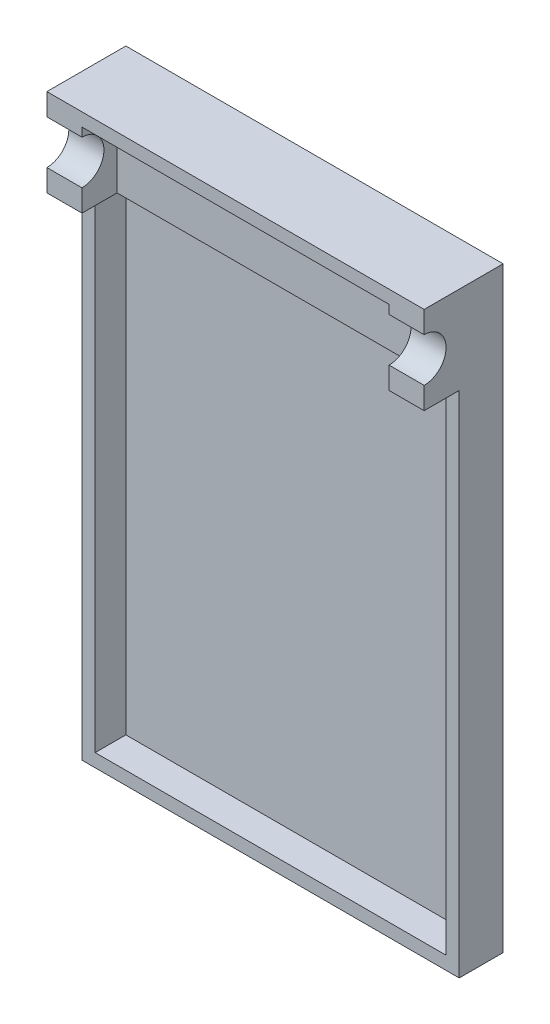
ISO-10303-21;
HEADER;
FILE_DESCRIPTION(('STEP AP214'),'2;1');
FILE_NAME('part.step','',(''),(''),'','','');
FILE_SCHEMA(('AUTOMOTIVE_DESIGN { 1 0 10303 214 1 1 1 1 }'));
ENDSEC;
DATA;
#1=APPLICATION_CONTEXT('core data for automotive mechanical design processes');
#2=APPLICATION_PROTOCOL_DEFINITION('international standard','automotive_design',2000,#1);
#3=PRODUCT_CONTEXT('',#1,'mechanical');
#4=PRODUCT('Part','Part','',(#3));
#5=PRODUCT_RELATED_PRODUCT_CATEGORY('part','',(#4));
#6=PRODUCT_DEFINITION_FORMATION('','',#4);
#7=PRODUCT_DEFINITION_CONTEXT('part definition',#1,'design');
#8=PRODUCT_DEFINITION('design','',#6,#7);
#9=PRODUCT_DEFINITION_SHAPE('','',#8);
#10=(LENGTH_UNIT() NAMED_UNIT(*) SI_UNIT(.MILLI.,.METRE.));
#11=(NAMED_UNIT(*) PLANE_ANGLE_UNIT() SI_UNIT($,.RADIAN.));
#12=(NAMED_UNIT(*) SI_UNIT($,.STERADIAN.) SOLID_ANGLE_UNIT());
#13=UNCERTAINTY_MEASURE_WITH_UNIT(LENGTH_MEASURE(1.E-05),#10,'distance_accuracy_value','');
#14=(GEOMETRIC_REPRESENTATION_CONTEXT(3) GLOBAL_UNCERTAINTY_ASSIGNED_CONTEXT((#13)) GLOBAL_UNIT_ASSIGNED_CONTEXT((#10,
#11,#12)) REPRESENTATION_CONTEXT('',''));
#15=CARTESIAN_POINT('',(0.,0.,0.));
#16=DIRECTION('',(0.,0.,1.));
#17=DIRECTION('',(1.,0.,0.));
#18=AXIS2_PLACEMENT_3D('',#15,#16,#17);
#19=CARTESIAN_POINT('',(-20.6487571144217,89.6274453394707,10.));
#20=DIRECTION('',(0.,-1.,0.));
#21=DIRECTION('',(0.,0.,-1.));
#22=AXIS2_PLACEMENT_3D('',#19,#20,#21);
#23=PLANE('',#22);
#24=DIRECTION('',(0.,0.,-1.));
#25=VECTOR('',#24,1.);
#26=CARTESIAN_POINT('',(-15.6487571144217,89.6274453394707,18.));
#27=LINE('',#26,#25);
#28=CARTESIAN_POINT('',(-15.6487571144217,89.6274453394707,18.));
#29=VERTEX_POINT('',#28);
#30=CARTESIAN_POINT('',(-15.6487571144217,89.6274453394707,10.));
#31=VERTEX_POINT('',#30);
#32=EDGE_CURVE('E203',#29,#31,#27,.T.);
#33=ORIENTED_EDGE('',*,*,#32,.T.);
#34=DIRECTION('',(1.,0.,0.));
#35=VECTOR('',#34,1.);
#36=CARTESIAN_POINT('',(-20.6487571144217,89.6274453394707,10.));
#37=LINE('',#36,#35);
#38=CARTESIAN_POINT('',(54.3512428855784,89.6274453394707,10.));
#39=VERTEX_POINT('',#38);
#40=EDGE_CURVE('E191',#31,#39,#37,.T.);
#41=ORIENTED_EDGE('',*,*,#40,.T.);
#42=DIRECTION('',(0.,0.,1.));
#43=VECTOR('',#42,1.);
#44=CARTESIAN_POINT('',(54.3512428855784,89.6274453394707,3.));
#45=LINE('',#44,#43);
#46=CARTESIAN_POINT('',(54.3512428855784,89.6274453394707,18.));
#47=VERTEX_POINT('',#46);
#48=EDGE_CURVE('E205',#39,#47,#45,.T.);
#49=ORIENTED_EDGE('',*,*,#48,.T.);
#50=DIRECTION('',(-1.,0.,0.));
#51=VECTOR('',#50,1.);
#52=CARTESIAN_POINT('',(-15.6487571144217,89.6274453394707,18.));
#53=LINE('',#52,#51);
#54=EDGE_CURVE('E208',#47,#29,#53,.T.);
#55=ORIENTED_EDGE('',*,*,#54,.T.);
#56=EDGE_LOOP('',(#33,#41,#49,#55));
#57=FACE_BOUND('',#56,.T.);
#58=ADVANCED_FACE('F35',(#57),#23,.T.);
#59=CARTESIAN_POINT('',(-20.6487571144217,89.6274453394707,10.));
#60=DIRECTION('',(1.,0.,0.));
#61=DIRECTION('',(0.,1.,0.));
#62=AXIS2_PLACEMENT_3D('',#59,#60,#61);
#63=PLANE('',#62);
#64=DIRECTION('',(0.,-1.,0.));
#65=VECTOR('',#64,1.);
#66=CARTESIAN_POINT('',(-20.6487571144217,0.,3.));
#67=LINE('',#66,#65);
#68=CARTESIAN_POINT('',(-20.6487571144217,79.6274453394707,3.));
#69=VERTEX_POINT('',#68);
#70=CARTESIAN_POINT('',(-20.6487571144217,-40.3725546605293,3.));
#71=VERTEX_POINT('',#70);
#72=EDGE_CURVE('E264',#69,#71,#67,.T.);
#73=ORIENTED_EDGE('',*,*,#72,.F.);
#74=DIRECTION('',(0.,0.707106781186547,-0.707106781186548));
#75=VECTOR('',#74,1.);
#76=CARTESIAN_POINT('',(-20.6487571144217,72.6274453394707,10.));
#77=LINE('',#76,#75);
#78=CARTESIAN_POINT('',(-20.6487571144217,72.6274453394707,10.));
#79=VERTEX_POINT('',#78);
#80=EDGE_CURVE('E196',#79,#69,#77,.T.);
#81=ORIENTED_EDGE('',*,*,#80,.F.);
#82=DIRECTION('',(0.,-1.,0.));
#83=VECTOR('',#82,1.);
#84=CARTESIAN_POINT('',(-20.6487571144217,89.6274453394707,10.));
#85=LINE('',#84,#83);
#86=CARTESIAN_POINT('',(-20.6487571144217,-40.3725546605293,10.));
#87=VERTEX_POINT('',#86);
#88=EDGE_CURVE('E266',#79,#87,#85,.T.);
#89=ORIENTED_EDGE('',*,*,#88,.T.);
#90=DIRECTION('',(0.,0.,-1.));
#91=VECTOR('',#90,1.);
#92=CARTESIAN_POINT('',(-20.6487571144217,-40.3725546605293,10.));
#93=LINE('',#92,#91);
#94=EDGE_CURVE('E276',#87,#71,#93,.T.);
#95=ORIENTED_EDGE('',*,*,#94,.T.);
#96=EDGE_LOOP('',(#73,#81,#89,#95));
#97=FACE_BOUND('',#96,.T.);
#98=ADVANCED_FACE('F356',(#97),#63,.T.);
#99=CARTESIAN_POINT('',(59.3512428855783,89.6274453394707,10.));
#100=DIRECTION('',(-1.,0.,0.));
#101=DIRECTION('',(0.,0.,1.));
#102=AXIS2_PLACEMENT_3D('',#99,#100,#101);
#103=PLANE('',#102);
#104=DIRECTION('',(0.,1.,0.));
#105=VECTOR('',#104,1.);
#106=CARTESIAN_POINT('',(59.3512428855783,89.6274453394707,10.));
#107=LINE('',#106,#105);
#108=CARTESIAN_POINT('',(59.3512428855783,-40.3725546605293,10.));
#109=VERTEX_POINT('',#108);
#110=CARTESIAN_POINT('',(59.3512428855783,72.6274453394707,10.));
#111=VERTEX_POINT('',#110);
#112=EDGE_CURVE('E271',#109,#111,#107,.T.);
#113=ORIENTED_EDGE('',*,*,#112,.T.);
#114=DIRECTION('',(0.,-0.707106781186547,0.707106781186548));
#115=VECTOR('',#114,1.);
#116=CARTESIAN_POINT('',(59.3512428855783,72.6274453394707,10.));
#117=LINE('',#116,#115);
#118=CARTESIAN_POINT('',(59.3512428855783,79.6274453394707,3.));
#119=VERTEX_POINT('',#118);
#120=EDGE_CURVE('E61',#119,#111,#117,.T.);
#121=ORIENTED_EDGE('',*,*,#120,.F.);
#122=DIRECTION('',(0.,-1.,0.));
#123=VECTOR('',#122,1.);
#124=CARTESIAN_POINT('',(59.3512428855783,0.,3.));
#125=LINE('',#124,#123);
#126=CARTESIAN_POINT('',(59.3512428855783,-40.3725546605293,3.));
#127=VERTEX_POINT('',#126);
#128=EDGE_CURVE('E262',#119,#127,#125,.T.);
#129=ORIENTED_EDGE('',*,*,#128,.T.);
#130=DIRECTION('',(0.,0.,-1.));
#131=VECTOR('',#130,1.);
#132=CARTESIAN_POINT('',(59.3512428855783,-40.3725546605293,10.));
#133=LINE('',#132,#131);
#134=EDGE_CURVE('E273',#109,#127,#133,.T.);
#135=ORIENTED_EDGE('',*,*,#134,.F.);
#136=EDGE_LOOP('',(#113,#121,#129,#135));
#137=FACE_BOUND('',#136,.T.);
#138=ADVANCED_FACE('F354',(#137),#103,.T.);
#139=CARTESIAN_POINT('',(0.,0.,3.));
#140=DIRECTION('',(0.,0.,1.));
#141=DIRECTION('',(1.,0.,0.));
#142=AXIS2_PLACEMENT_3D('',#139,#140,#141);
#143=PLANE('',#142);
#144=ORIENTED_EDGE('',*,*,#128,.F.);
#145=DIRECTION('',(-1.,0.,0.));
#146=VECTOR('',#145,1.);
#147=CARTESIAN_POINT('',(0.,79.6274453394707,3.));
#148=LINE('',#147,#146);
#149=EDGE_CURVE('E53',#119,#69,#148,.T.);
#150=ORIENTED_EDGE('',*,*,#149,.T.);
#151=ORIENTED_EDGE('',*,*,#72,.T.);
#152=DIRECTION('',(-1.,0.,0.));
#153=VECTOR('',#152,1.);
#154=CARTESIAN_POINT('',(0.,-40.3725546605293,3.));
#155=LINE('',#154,#153);
#156=EDGE_CURVE('E248',#127,#71,#155,.T.);
#157=ORIENTED_EDGE('',*,*,#156,.F.);
#158=EDGE_LOOP('',(#144,#150,#151,#157));
#159=FACE_BOUND('',#158,.T.);
#160=ADVANCED_FACE('F359',(#159),#143,.T.);
#161=CARTESIAN_POINT('',(62.3512428855784,82.6274453394707,18.));
#162=DIRECTION('',(-1.,0.,0.));
#163=DIRECTION('',(0.,0.,1.));
#164=AXIS2_PLACEMENT_3D('',#161,#162,#163);
#165=CYLINDRICAL_SURFACE('',#164,5.);
#166=DIRECTION('',(-1.,0.,0.));
#167=VECTOR('',#166,1.);
#168=CARTESIAN_POINT('',(62.3512428855784,87.6274453394707,18.));
#169=LINE('',#168,#167);
#170=CARTESIAN_POINT('',(62.3512428855784,87.6274453394707,18.));
#171=VERTEX_POINT('',#170);
#172=CARTESIAN_POINT('',(54.3512428855784,87.6274453394707,18.));
#173=VERTEX_POINT('',#172);
#174=EDGE_CURVE('E257',#171,#173,#169,.T.);
#175=ORIENTED_EDGE('',*,*,#174,.T.);
#176=CARTESIAN_POINT('',(54.3512428855784,82.6274453394707,18.));
#177=DIRECTION('',(1.,0.,0.));
#178=DIRECTION('',(0.,0.,-1.));
#179=AXIS2_PLACEMENT_3D('',#176,#177,#178);
#180=CIRCLE('',#179,5.);
#181=CARTESIAN_POINT('',(54.3512428855784,77.6274453394707,18.));
#182=VERTEX_POINT('',#181);
#183=EDGE_CURVE('E221',#173,#182,#180,.F.);
#184=ORIENTED_EDGE('',*,*,#183,.T.);
#185=DIRECTION('',(-1.,0.,0.));
#186=VECTOR('',#185,1.);
#187=CARTESIAN_POINT('',(62.3512428855784,77.6274453394707,18.));
#188=LINE('',#187,#186);
#189=CARTESIAN_POINT('',(62.3512428855784,77.6274453394707,18.));
#190=VERTEX_POINT('',#189);
#191=EDGE_CURVE('E245',#190,#182,#188,.T.);
#192=ORIENTED_EDGE('',*,*,#191,.F.);
#193=CARTESIAN_POINT('',(62.3512428855784,82.6274453394707,18.));
#194=DIRECTION('',(-1.,0.,0.));
#195=DIRECTION('',(0.,0.,1.));
#196=AXIS2_PLACEMENT_3D('',#193,#194,#195);
#197=CIRCLE('',#196,5.);
#198=EDGE_CURVE('E225',#171,#190,#197,.T.);
#199=ORIENTED_EDGE('',*,*,#198,.F.);
#200=EDGE_LOOP('',(#175,#184,#192,#199));
#201=FACE_BOUND('',#200,.T.);
#202=ADVANCED_FACE('F343',(#201),#165,.F.);
#203=CARTESIAN_POINT('',(62.3512428855784,0.,18.));
#204=DIRECTION('',(0.,0.,-1.));
#205=DIRECTION('',(-1.,0.,0.));
#206=AXIS2_PLACEMENT_3D('',#203,#204,#205);
#207=PLANE('',#206);
#208=ORIENTED_EDGE('',*,*,#191,.T.);
#209=DIRECTION('',(0.,-1.,0.));
#210=VECTOR('',#209,1.);
#211=CARTESIAN_POINT('',(54.3512428855784,89.6274453394707,18.));
#212=LINE('',#211,#210);
#213=CARTESIAN_POINT('',(54.3512428855784,72.6274453394707,18.));
#214=VERTEX_POINT('',#213);
#215=EDGE_CURVE('E210',#182,#214,#212,.T.);
#216=ORIENTED_EDGE('',*,*,#215,.T.);
#217=DIRECTION('',(-1.,0.,0.));
#218=VECTOR('',#217,1.);
#219=CARTESIAN_POINT('',(62.3512428855784,72.6274453394707,18.));
#220=LINE('',#219,#218);
#221=CARTESIAN_POINT('',(62.3512428855784,72.6274453394707,18.));
#222=VERTEX_POINT('',#221);
#223=EDGE_CURVE('E250',#222,#214,#220,.T.);
#224=ORIENTED_EDGE('',*,*,#223,.F.);
#225=DIRECTION('',(0.,-1.,0.));
#226=VECTOR('',#225,1.);
#227=CARTESIAN_POINT('',(62.3512428855784,0.,18.));
#228=LINE('',#227,#226);
#229=EDGE_CURVE('E233',#190,#222,#228,.T.);
#230=ORIENTED_EDGE('',*,*,#229,.F.);
#231=EDGE_LOOP('',(#208,#216,#224,#230));
#232=FACE_BOUND('',#231,.T.);
#233=ADVANCED_FACE('F346',(#232),#207,.F.);
#234=CARTESIAN_POINT('',(62.3512428855784,72.6274453394707,0.));
#235=DIRECTION('',(0.,1.,0.));
#236=DIRECTION('',(0.,0.,1.));
#237=AXIS2_PLACEMENT_3D('',#234,#235,#236);
#238=PLANE('',#237);
#239=ORIENTED_EDGE('',*,*,#223,.T.);
#240=DIRECTION('',(0.,0.,1.));
#241=VECTOR('',#240,1.);
#242=CARTESIAN_POINT('',(54.3512428855784,72.6274453394707,18.));
#243=LINE('',#242,#241);
#244=CARTESIAN_POINT('',(54.3512428855784,72.6274453394707,10.));
#245=VERTEX_POINT('',#244);
#246=EDGE_CURVE('E182',#245,#214,#243,.T.);
#247=ORIENTED_EDGE('',*,*,#246,.F.);
#248=DIRECTION('',(-1.,0.,0.));
#249=VECTOR('',#248,1.);
#250=CARTESIAN_POINT('',(62.3512428855784,72.6274453394707,10.));
#251=LINE('',#250,#249);
#252=EDGE_CURVE('E46',#111,#245,#251,.T.);
#253=ORIENTED_EDGE('',*,*,#252,.F.);
#254=CARTESIAN_POINT('',(62.3512428855784,72.6274453394707,10.));
#255=VERTEX_POINT('',#254);
#256=EDGE_CURVE('E45',#255,#111,#251,.T.);
#257=ORIENTED_EDGE('',*,*,#256,.F.);
#258=DIRECTION('',(0.,0.,-1.));
#259=VECTOR('',#258,1.);
#260=CARTESIAN_POINT('',(62.3512428855784,72.6274453394707,0.));
#261=LINE('',#260,#259);
#262=EDGE_CURVE('E231',#222,#255,#261,.T.);
#263=ORIENTED_EDGE('',*,*,#262,.F.);
#264=EDGE_LOOP('',(#239,#247,#253,#257,#263));
#265=FACE_BOUND('',#264,.T.);
#266=ADVANCED_FACE('F351',(#265),#238,.F.);
#267=CARTESIAN_POINT('',(0.,0.,10.));
#268=DIRECTION('',(0.,0.,-1.));
#269=DIRECTION('',(-1.,0.,0.));
#270=AXIS2_PLACEMENT_3D('',#267,#268,#269);
#271=PLANE('',#270);
#272=DIRECTION('',(0.,1.,0.));
#273=VECTOR('',#272,1.);
#274=CARTESIAN_POINT('',(62.3512428855784,92.6274453394707,10.));
#275=LINE('',#274,#273);
#276=CARTESIAN_POINT('',(62.3512428855784,-43.3725546605293,10.));
#277=VERTEX_POINT('',#276);
#278=EDGE_CURVE('E280',#277,#255,#275,.T.);
#279=ORIENTED_EDGE('',*,*,#278,.T.);
#280=ORIENTED_EDGE('',*,*,#256,.T.);
#281=ORIENTED_EDGE('',*,*,#112,.F.);
#282=DIRECTION('',(1.,0.,0.));
#283=VECTOR('',#282,1.);
#284=CARTESIAN_POINT('',(59.3512428855783,-40.3725546605293,10.));
#285=LINE('',#284,#283);
#286=EDGE_CURVE('E268',#87,#109,#285,.T.);
#287=ORIENTED_EDGE('',*,*,#286,.F.);
#288=ORIENTED_EDGE('',*,*,#88,.F.);
#289=CARTESIAN_POINT('',(-23.6487571144217,72.6274453394707,10.));
#290=VERTEX_POINT('',#289);
#291=EDGE_CURVE('E11',#79,#290,#251,.T.);
#292=ORIENTED_EDGE('',*,*,#291,.T.);
#293=DIRECTION('',(0.,-1.,0.));
#294=VECTOR('',#293,1.);
#295=CARTESIAN_POINT('',(-23.6487571144217,92.6274453394707,10.));
#296=LINE('',#295,#294);
#297=CARTESIAN_POINT('',(-23.6487571144217,-43.3725546605293,10.));
#298=VERTEX_POINT('',#297);
#299=EDGE_CURVE('E283',#290,#298,#296,.T.);
#300=ORIENTED_EDGE('',*,*,#299,.T.);
#301=DIRECTION('',(1.,0.,0.));
#302=VECTOR('',#301,1.);
#303=CARTESIAN_POINT('',(62.3512428855784,-43.3725546605293,10.));
#304=LINE('',#303,#302);
#305=EDGE_CURVE('E286',#298,#277,#304,.T.);
#306=ORIENTED_EDGE('',*,*,#305,.T.);
#307=EDGE_LOOP('',(#279,#280,#281,#287,#288,#292,#300,#306));
#308=FACE_BOUND('',#307,.T.);
#309=ADVANCED_FACE('F324',(#308),#271,.F.);
#310=CARTESIAN_POINT('',(0.,0.,0.));
#311=DIRECTION('',(0.,0.,-1.));
#312=DIRECTION('',(-1.,0.,0.));
#313=AXIS2_PLACEMENT_3D('',#310,#311,#312);
#314=PLANE('',#313);
#315=DIRECTION('',(0.,-1.,0.));
#316=VECTOR('',#315,1.);
#317=CARTESIAN_POINT('',(-23.6487571144217,92.6274453394707,0.));
#318=LINE('',#317,#316);
#319=CARTESIAN_POINT('',(-23.6487571144217,92.6274453394707,0.));
#320=VERTEX_POINT('',#319);
#321=CARTESIAN_POINT('',(-23.6487571144217,-43.3725546605293,0.));
#322=VERTEX_POINT('',#321);
#323=EDGE_CURVE('E293',#320,#322,#318,.T.);
#324=ORIENTED_EDGE('',*,*,#323,.F.);
#325=DIRECTION('',(-1.,0.,0.));
#326=VECTOR('',#325,1.);
#327=CARTESIAN_POINT('',(-23.6487571144217,92.6274453394707,0.));
#328=LINE('',#327,#326);
#329=CARTESIAN_POINT('',(62.3512428855784,92.6274453394707,0.));
#330=VERTEX_POINT('',#329);
#331=EDGE_CURVE('E291',#330,#320,#328,.T.);
#332=ORIENTED_EDGE('',*,*,#331,.F.);
#333=DIRECTION('',(0.,1.,0.));
#334=VECTOR('',#333,1.);
#335=CARTESIAN_POINT('',(62.3512428855784,92.6274453394707,0.));
#336=LINE('',#335,#334);
#337=CARTESIAN_POINT('',(62.3512428855784,-43.3725546605293,0.));
#338=VERTEX_POINT('',#337);
#339=EDGE_CURVE('E279',#338,#330,#336,.T.);
#340=ORIENTED_EDGE('',*,*,#339,.F.);
#341=DIRECTION('',(1.,0.,0.));
#342=VECTOR('',#341,1.);
#343=CARTESIAN_POINT('',(62.3512428855784,-43.3725546605293,0.));
#344=LINE('',#343,#342);
#345=EDGE_CURVE('E284',#322,#338,#344,.T.);
#346=ORIENTED_EDGE('',*,*,#345,.F.);
#347=EDGE_LOOP('',(#324,#332,#340,#346));
#348=FACE_BOUND('',#347,.T.);
#349=ADVANCED_FACE('F316',(#348),#314,.T.);
#350=CARTESIAN_POINT('',(62.3512428855784,92.6274453394707,10.));
#351=DIRECTION('',(-1.,0.,0.));
#352=DIRECTION('',(0.,0.,1.));
#353=AXIS2_PLACEMENT_3D('',#350,#351,#352);
#354=PLANE('',#353);
#355=ORIENTED_EDGE('',*,*,#339,.T.);
#356=DIRECTION('',(0.,0.,-1.));
#357=VECTOR('',#356,1.);
#358=CARTESIAN_POINT('',(62.3512428855784,92.6274453394707,10.));
#359=LINE('',#358,#357);
#360=CARTESIAN_POINT('',(62.3512428855784,92.6274453394707,18.));
#361=VERTEX_POINT('',#360);
#362=EDGE_CURVE('E39',#361,#330,#359,.T.);
#363=ORIENTED_EDGE('',*,*,#362,.F.);
#364=DIRECTION('',(0.,-1.,0.));
#365=VECTOR('',#364,1.);
#366=CARTESIAN_POINT('',(62.3512428855784,0.,18.0000000000002));
#367=LINE('',#366,#365);
#368=EDGE_CURVE('E228',#361,#171,#367,.T.);
#369=ORIENTED_EDGE('',*,*,#368,.T.);
#370=ORIENTED_EDGE('',*,*,#198,.T.);
#371=ORIENTED_EDGE('',*,*,#229,.T.);
#372=ORIENTED_EDGE('',*,*,#262,.T.);
#373=ORIENTED_EDGE('',*,*,#278,.F.);
#374=DIRECTION('',(0.,0.,-1.));
#375=VECTOR('',#374,1.);
#376=CARTESIAN_POINT('',(62.3512428855784,-43.3725546605293,10.));
#377=LINE('',#376,#375);
#378=EDGE_CURVE('E288',#277,#338,#377,.T.);
#379=ORIENTED_EDGE('',*,*,#378,.T.);
#380=EDGE_LOOP('',(#355,#363,#369,#370,#371,#372,#373,#379));
#381=FACE_BOUND('',#380,.T.);
#382=ADVANCED_FACE('F37',(#381),#354,.F.);
#383=CARTESIAN_POINT('',(-23.6487571144217,92.6274453394707,10.));
#384=DIRECTION('',(0.,-1.,0.));
#385=DIRECTION('',(0.,0.,-1.));
#386=AXIS2_PLACEMENT_3D('',#383,#384,#385);
#387=PLANE('',#386);
#388=ORIENTED_EDGE('',*,*,#331,.T.);
#389=DIRECTION('',(0.,0.,-1.));
#390=VECTOR('',#389,1.);
#391=CARTESIAN_POINT('',(-23.6487571144217,92.6274453394707,10.));
#392=LINE('',#391,#390);
#393=CARTESIAN_POINT('',(-23.6487571144217,92.6274453394707,18.));
#394=VERTEX_POINT('',#393);
#395=EDGE_CURVE('E300',#394,#320,#392,.T.);
#396=ORIENTED_EDGE('',*,*,#395,.F.);
#397=DIRECTION('',(-1.,0.,0.));
#398=VECTOR('',#397,1.);
#399=CARTESIAN_POINT('',(62.3512428855784,92.6274453394707,18.));
#400=LINE('',#399,#398);
#401=EDGE_CURVE('E174',#361,#394,#400,.T.);
#402=ORIENTED_EDGE('',*,*,#401,.F.);
#403=ORIENTED_EDGE('',*,*,#362,.T.);
#404=EDGE_LOOP('',(#388,#396,#402,#403));
#405=FACE_BOUND('',#404,.T.);
#406=ADVANCED_FACE('F308',(#405),#387,.F.);
#407=CARTESIAN_POINT('',(-23.6487571144217,92.6274453394707,10.));
#408=DIRECTION('',(1.,0.,0.));
#409=DIRECTION('',(0.,0.,-1.));
#410=AXIS2_PLACEMENT_3D('',#407,#408,#409);
#411=PLANE('',#410);
#412=ORIENTED_EDGE('',*,*,#323,.T.);
#413=DIRECTION('',(0.,0.,-1.));
#414=VECTOR('',#413,1.);
#415=CARTESIAN_POINT('',(-23.6487571144217,-43.3725546605293,10.));
#416=LINE('',#415,#414);
#417=EDGE_CURVE('E298',#298,#322,#416,.T.);
#418=ORIENTED_EDGE('',*,*,#417,.F.);
#419=ORIENTED_EDGE('',*,*,#299,.F.);
#420=DIRECTION('',(0.,0.,-1.));
#421=VECTOR('',#420,1.);
#422=CARTESIAN_POINT('',(-23.6487571144217,72.6274453394707,0.));
#423=LINE('',#422,#421);
#424=CARTESIAN_POINT('',(-23.6487571144217,72.6274453394707,18.));
#425=VERTEX_POINT('',#424);
#426=EDGE_CURVE('E241',#425,#290,#423,.T.);
#427=ORIENTED_EDGE('',*,*,#426,.F.);
#428=DIRECTION('',(0.,-1.,0.));
#429=VECTOR('',#428,1.);
#430=CARTESIAN_POINT('',(-23.6487571144217,0.,18.));
#431=LINE('',#430,#429);
#432=CARTESIAN_POINT('',(-23.6487571144217,77.6274453394707,18.));
#433=VERTEX_POINT('',#432);
#434=EDGE_CURVE('E229',#433,#425,#431,.T.);
#435=ORIENTED_EDGE('',*,*,#434,.F.);
#436=CARTESIAN_POINT('',(-23.6487571144217,82.6274453394707,18.));
#437=DIRECTION('',(-1.,0.,0.));
#438=DIRECTION('',(0.,0.,1.));
#439=AXIS2_PLACEMENT_3D('',#436,#437,#438);
#440=CIRCLE('',#439,5.);
#441=CARTESIAN_POINT('',(-23.6487571144217,87.6274453394707,18.));
#442=VERTEX_POINT('',#441);
#443=EDGE_CURVE('E224',#442,#433,#440,.T.);
#444=ORIENTED_EDGE('',*,*,#443,.F.);
#445=DIRECTION('',(0.,-1.,0.));
#446=VECTOR('',#445,1.);
#447=CARTESIAN_POINT('',(-23.6487571144217,0.,18.0000000000002));
#448=LINE('',#447,#446);
#449=EDGE_CURVE('E238',#394,#442,#448,.T.);
#450=ORIENTED_EDGE('',*,*,#449,.F.);
#451=ORIENTED_EDGE('',*,*,#395,.T.);
#452=EDGE_LOOP('',(#412,#418,#419,#427,#435,#444,#450,#451));
#453=FACE_BOUND('',#452,.T.);
#454=ADVANCED_FACE('F318',(#453),#411,.F.);
#455=CARTESIAN_POINT('',(62.3512428855784,-43.3725546605293,10.));
#456=DIRECTION('',(0.,1.,0.));
#457=DIRECTION('',(0.,0.,1.));
#458=AXIS2_PLACEMENT_3D('',#455,#456,#457);
#459=PLANE('',#458);
#460=ORIENTED_EDGE('',*,*,#345,.T.);
#461=ORIENTED_EDGE('',*,*,#378,.F.);
#462=ORIENTED_EDGE('',*,*,#305,.F.);
#463=ORIENTED_EDGE('',*,*,#417,.T.);
#464=EDGE_LOOP('',(#460,#461,#462,#463));
#465=FACE_BOUND('',#464,.T.);
#466=ADVANCED_FACE('F322',(#465),#459,.F.);
#467=CARTESIAN_POINT('',(59.3512428855783,-40.3725546605293,10.));
#468=DIRECTION('',(0.,1.,0.));
#469=DIRECTION('',(0.,0.,1.));
#470=AXIS2_PLACEMENT_3D('',#467,#468,#469);
#471=PLANE('',#470);
#472=ORIENTED_EDGE('',*,*,#156,.T.);
#473=ORIENTED_EDGE('',*,*,#94,.F.);
#474=ORIENTED_EDGE('',*,*,#286,.T.);
#475=ORIENTED_EDGE('',*,*,#134,.T.);
#476=EDGE_LOOP('',(#472,#473,#474,#475));
#477=FACE_BOUND('',#476,.T.);
#478=ADVANCED_FACE('F361',(#477),#471,.T.);
#479=CARTESIAN_POINT('',(-15.6487571144217,77.6274453394707,18.));
#480=VERTEX_POINT('',#479);
#481=EDGE_CURVE('E249',#480,#433,#188,.T.);
#482=ORIENTED_EDGE('',*,*,#481,.F.);
#483=CARTESIAN_POINT('',(-15.6487571144217,82.6274453394707,18.));
#484=DIRECTION('',(-1.,0.,0.));
#485=DIRECTION('',(0.,0.,1.));
#486=AXIS2_PLACEMENT_3D('',#483,#484,#485);
#487=CIRCLE('',#486,5.);
#488=CARTESIAN_POINT('',(-15.6487571144217,87.6274453394707,18.));
#489=VERTEX_POINT('',#488);
#490=EDGE_CURVE('E192',#480,#489,#487,.F.);
#491=ORIENTED_EDGE('',*,*,#490,.T.);
#492=EDGE_CURVE('E235',#489,#442,#169,.T.);
#493=ORIENTED_EDGE('',*,*,#492,.T.);
#494=ORIENTED_EDGE('',*,*,#443,.T.);
#495=EDGE_LOOP('',(#482,#491,#493,#494));
#496=FACE_BOUND('',#495,.T.);
#497=ADVANCED_FACE('F332',(#496),#165,.F.);
#498=CARTESIAN_POINT('',(-15.6487571144217,72.6274453394707,18.));
#499=VERTEX_POINT('',#498);
#500=EDGE_CURVE('E252',#499,#425,#220,.T.);
#501=ORIENTED_EDGE('',*,*,#500,.F.);
#502=DIRECTION('',(0.,-1.,0.));
#503=VECTOR('',#502,1.);
#504=CARTESIAN_POINT('',(-15.6487571144217,89.6274453394707,18.));
#505=LINE('',#504,#503);
#506=EDGE_CURVE('E181',#480,#499,#505,.T.);
#507=ORIENTED_EDGE('',*,*,#506,.F.);
#508=ORIENTED_EDGE('',*,*,#481,.T.);
#509=ORIENTED_EDGE('',*,*,#434,.T.);
#510=EDGE_LOOP('',(#501,#507,#508,#509));
#511=FACE_BOUND('',#510,.T.);
#512=ADVANCED_FACE('F329',(#511),#207,.F.);
#513=CARTESIAN_POINT('',(-15.6487571144217,72.6274453394707,10.));
#514=VERTEX_POINT('',#513);
#515=EDGE_CURVE('E165',#514,#79,#251,.T.);
#516=ORIENTED_EDGE('',*,*,#515,.F.);
#517=DIRECTION('',(0.,0.,-1.));
#518=VECTOR('',#517,1.);
#519=CARTESIAN_POINT('',(-15.6487571144217,72.6274453394707,10.));
#520=LINE('',#519,#518);
#521=EDGE_CURVE('E168',#499,#514,#520,.T.);
#522=ORIENTED_EDGE('',*,*,#521,.F.);
#523=ORIENTED_EDGE('',*,*,#500,.T.);
#524=ORIENTED_EDGE('',*,*,#426,.T.);
#525=ORIENTED_EDGE('',*,*,#291,.F.);
#526=EDGE_LOOP('',(#516,#522,#523,#524,#525));
#527=FACE_BOUND('',#526,.T.);
#528=ADVANCED_FACE('F167',(#527),#238,.F.);
#529=CARTESIAN_POINT('',(62.3512428855784,0.,18.0000000000002));
#530=DIRECTION('',(0.,0.,-1.));
#531=DIRECTION('',(0.,1.,0.));
#532=AXIS2_PLACEMENT_3D('',#529,#530,#531);
#533=PLANE('',#532);
#534=ORIENTED_EDGE('',*,*,#54,.F.);
#535=EDGE_CURVE('E214',#47,#173,#212,.T.);
#536=ORIENTED_EDGE('',*,*,#535,.T.);
#537=ORIENTED_EDGE('',*,*,#174,.F.);
#538=ORIENTED_EDGE('',*,*,#368,.F.);
#539=ORIENTED_EDGE('',*,*,#401,.T.);
#540=ORIENTED_EDGE('',*,*,#449,.T.);
#541=ORIENTED_EDGE('',*,*,#492,.F.);
#542=EDGE_CURVE('E193',#29,#489,#505,.T.);
#543=ORIENTED_EDGE('',*,*,#542,.F.);
#544=EDGE_LOOP('',(#534,#536,#537,#538,#539,#540,#541,#543));
#545=FACE_BOUND('',#544,.T.);
#546=ADVANCED_FACE('F336',(#545),#533,.F.);
#547=CARTESIAN_POINT('',(54.3512428855784,89.6274453394707,18.));
#548=DIRECTION('',(1.,0.,0.));
#549=DIRECTION('',(0.,0.,-1.));
#550=AXIS2_PLACEMENT_3D('',#547,#548,#549);
#551=PLANE('',#550);
#552=ORIENTED_EDGE('',*,*,#535,.F.);
#553=ORIENTED_EDGE('',*,*,#48,.F.);
#554=DIRECTION('',(0.,1.,0.));
#555=VECTOR('',#554,1.);
#556=CARTESIAN_POINT('',(54.3512428855784,0.,10.));
#557=LINE('',#556,#555);
#558=EDGE_CURVE('E219',#245,#39,#557,.T.);
#559=ORIENTED_EDGE('',*,*,#558,.F.);
#560=ORIENTED_EDGE('',*,*,#246,.T.);
#561=ORIENTED_EDGE('',*,*,#215,.F.);
#562=ORIENTED_EDGE('',*,*,#183,.F.);
#563=EDGE_LOOP('',(#552,#553,#559,#560,#561,#562));
#564=FACE_BOUND('',#563,.T.);
#565=ADVANCED_FACE('F447',(#564),#551,.F.);
#566=CARTESIAN_POINT('',(-15.6487571144217,89.6274453394707,10.));
#567=DIRECTION('',(-1.,0.,0.));
#568=DIRECTION('',(0.,0.,1.));
#569=AXIS2_PLACEMENT_3D('',#566,#567,#568);
#570=PLANE('',#569);
#571=ORIENTED_EDGE('',*,*,#506,.T.);
#572=ORIENTED_EDGE('',*,*,#521,.T.);
#573=DIRECTION('',(0.,-1.,0.));
#574=VECTOR('',#573,1.);
#575=CARTESIAN_POINT('',(-15.6487571144217,0.,10.));
#576=LINE('',#575,#574);
#577=EDGE_CURVE('E178',#31,#514,#576,.T.);
#578=ORIENTED_EDGE('',*,*,#577,.F.);
#579=ORIENTED_EDGE('',*,*,#32,.F.);
#580=ORIENTED_EDGE('',*,*,#542,.T.);
#581=ORIENTED_EDGE('',*,*,#490,.F.);
#582=EDGE_LOOP('',(#571,#572,#578,#579,#580,#581));
#583=FACE_BOUND('',#582,.T.);
#584=ADVANCED_FACE('F177',(#583),#570,.F.);
#585=CARTESIAN_POINT('',(81.7119226605762,72.6274453394707,10.));
#586=DIRECTION('',(0.,0.,-1.));
#587=DIRECTION('',(-1.,0.,0.));
#588=AXIS2_PLACEMENT_3D('',#585,#586,#587);
#589=PLANE('',#588);
#590=DIRECTION('',(-1.,0.,0.));
#591=VECTOR('',#590,1.);
#592=CARTESIAN_POINT('',(81.7119226605762,72.6274453394707,10.));
#593=LINE('',#592,#591);
#594=EDGE_CURVE('E189',#245,#514,#593,.T.);
#595=ORIENTED_EDGE('',*,*,#594,.F.);
#596=ORIENTED_EDGE('',*,*,#558,.T.);
#597=ORIENTED_EDGE('',*,*,#40,.F.);
#598=ORIENTED_EDGE('',*,*,#577,.T.);
#599=EDGE_LOOP('',(#595,#596,#597,#598));
#600=FACE_BOUND('',#599,.T.);
#601=ADVANCED_FACE('F187',(#600),#589,.F.);
#602=CARTESIAN_POINT('',(81.7119226605762,72.6274453394707,10.));
#603=DIRECTION('',(0.,0.707106781186548,0.707106781186547));
#604=DIRECTION('',(0.,-0.707106781186547,0.707106781186548));
#605=AXIS2_PLACEMENT_3D('',#602,#603,#604);
#606=PLANE('',#605);
#607=ORIENTED_EDGE('',*,*,#149,.F.);
#608=ORIENTED_EDGE('',*,*,#120,.T.);
#609=ORIENTED_EDGE('',*,*,#252,.T.);
#610=ORIENTED_EDGE('',*,*,#594,.T.);
#611=ORIENTED_EDGE('',*,*,#515,.T.);
#612=ORIENTED_EDGE('',*,*,#80,.T.);
#613=EDGE_LOOP('',(#607,#608,#609,#610,#611,#612));
#614=FACE_BOUND('',#613,.T.);
#615=ADVANCED_FACE('F195',(#614),#606,.F.);
#616=CLOSED_SHELL('',(#58,#98,#138,#160,#202,#233,#266,#309,#349,#382,#406,#454,#466,#478,#497,
#512,#528,#546,#565,#584,#601,#615));
#617=MANIFOLD_SOLID_BREP('B2',#616);
#618=ADVANCED_BREP_SHAPE_REPRESENTATION('',(#18,#617),#14);
#619=SHAPE_DEFINITION_REPRESENTATION(#9,#618);
ENDSEC;
END-ISO-10303-21;
